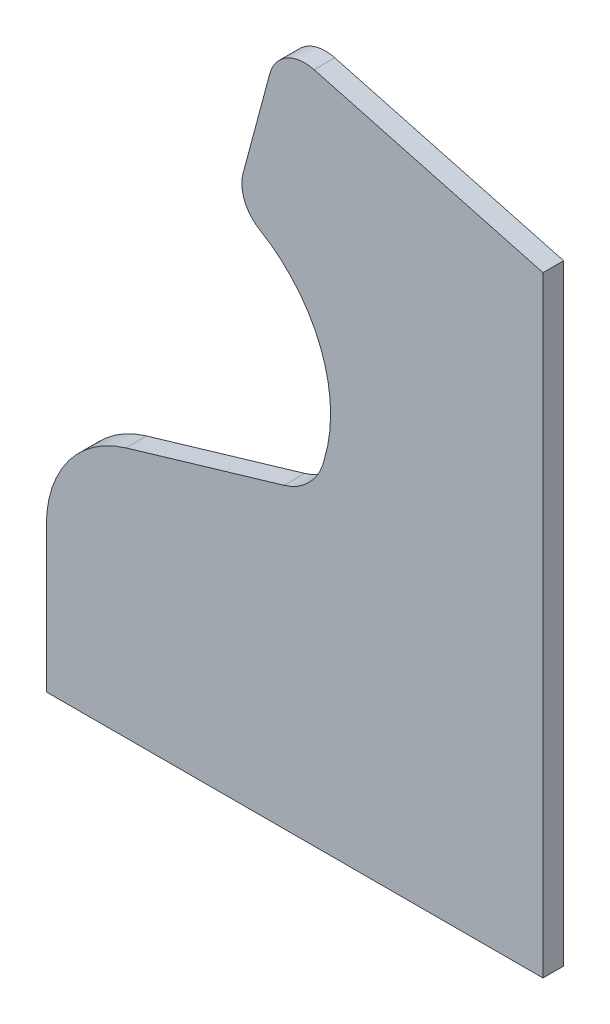
ISO-10303-21;
HEADER;
FILE_DESCRIPTION(('STEP AP214'),'2;1');
FILE_NAME('part.step','',(''),(''),'','','');
FILE_SCHEMA(('AUTOMOTIVE_DESIGN { 1 0 10303 214 1 1 1 1 }'));
ENDSEC;
DATA;
#1=APPLICATION_CONTEXT('core data for automotive mechanical design processes');
#2=APPLICATION_PROTOCOL_DEFINITION('international standard','automotive_design',2000,#1);
#3=PRODUCT_CONTEXT('',#1,'mechanical');
#4=PRODUCT('Part','Part','',(#3));
#5=PRODUCT_RELATED_PRODUCT_CATEGORY('part','',(#4));
#6=PRODUCT_DEFINITION_FORMATION('','',#4);
#7=PRODUCT_DEFINITION_CONTEXT('part definition',#1,'design');
#8=PRODUCT_DEFINITION('design','',#6,#7);
#9=PRODUCT_DEFINITION_SHAPE('','',#8);
#10=(LENGTH_UNIT() NAMED_UNIT(*) SI_UNIT(.MILLI.,.METRE.));
#11=(NAMED_UNIT(*) PLANE_ANGLE_UNIT() SI_UNIT($,.RADIAN.));
#12=(NAMED_UNIT(*) SI_UNIT($,.STERADIAN.) SOLID_ANGLE_UNIT());
#13=UNCERTAINTY_MEASURE_WITH_UNIT(LENGTH_MEASURE(1.E-05),#10,'distance_accuracy_value','');
#14=(GEOMETRIC_REPRESENTATION_CONTEXT(3) GLOBAL_UNCERTAINTY_ASSIGNED_CONTEXT((#13)) GLOBAL_UNIT_ASSIGNED_CONTEXT((#10,
#11,#12)) REPRESENTATION_CONTEXT('',''));
#15=CARTESIAN_POINT('',(0.,0.,0.));
#16=DIRECTION('',(0.,0.,1.));
#17=DIRECTION('',(1.,0.,0.));
#18=AXIS2_PLACEMENT_3D('',#15,#16,#17);
#19=CARTESIAN_POINT('',(90.0769515458648,336.171759760097,10.));
#20=DIRECTION('',(0.258819045102514,0.96592582628907,0.));
#21=DIRECTION('',(-0.96592582628907,0.258819045102514,0.));
#22=AXIS2_PLACEMENT_3D('',#19,#20,#21);
#23=PLANE('',#22);
#24=DIRECTION('',(0.96592582628907,-0.258819045102514,0.));
#25=VECTOR('',#24,1.);
#26=CARTESIAN_POINT('',(90.0769515458648,336.171759760097,0.));
#27=LINE('',#26,#25);
#28=CARTESIAN_POINT('',(129.081215867117,325.720598633847,0.));
#29=VERTEX_POINT('',#28);
#30=CARTESIAN_POINT('',(240.,296.,0.));
#31=VERTEX_POINT('',#30);
#32=EDGE_CURVE('E169',#29,#31,#27,.T.);
#33=ORIENTED_EDGE('',*,*,#32,.F.);
#34=DIRECTION('',(0.,0.,-1.));
#35=VECTOR('',#34,1.);
#36=CARTESIAN_POINT('',(129.081215867117,325.720598633847,10.));
#37=LINE('',#36,#35);
#38=CARTESIAN_POINT('',(129.081215867117,325.720598633847,10.));
#39=VERTEX_POINT('',#38);
#40=EDGE_CURVE('E11',#39,#29,#37,.T.);
#41=ORIENTED_EDGE('',*,*,#40,.F.);
#42=DIRECTION('',(0.96592582628907,-0.258819045102514,0.));
#43=VECTOR('',#42,1.);
#44=CARTESIAN_POINT('',(90.0769515458648,336.171759760097,10.));
#45=LINE('',#44,#43);
#46=CARTESIAN_POINT('',(240.,296.,10.));
#47=VERTEX_POINT('',#46);
#48=EDGE_CURVE('E208',#39,#47,#45,.T.);
#49=ORIENTED_EDGE('',*,*,#48,.T.);
#50=DIRECTION('',(0.,0.,-1.));
#51=VECTOR('',#50,1.);
#52=CARTESIAN_POINT('',(240.,296.,10.));
#53=LINE('',#52,#51);
#54=EDGE_CURVE('E109',#47,#31,#53,.T.);
#55=ORIENTED_EDGE('',*,*,#54,.T.);
#56=EDGE_LOOP('',(#33,#41,#49,#55));
#57=FACE_BOUND('',#56,.T.);
#58=ADVANCED_FACE('F49',(#57),#23,.T.);
#59=CARTESIAN_POINT('',(124.543141157005,308.784273247164,10.));
#60=DIRECTION('',(0.,0.,-1.));
#61=DIRECTION('',(-1.,0.,0.));
#62=AXIS2_PLACEMENT_3D('',#59,#60,#61);
#63=CYLINDRICAL_SURFACE('',#62,17.5337742565075);
#64=CARTESIAN_POINT('',(124.543141157005,308.784273247164,0.));
#65=DIRECTION('',(0.,0.,1.));
#66=DIRECTION('',(1.,0.,0.));
#67=AXIS2_PLACEMENT_3D('',#64,#65,#66);
#68=CIRCLE('',#67,17.5337742565075);
#69=CARTESIAN_POINT('',(107.606815770322,313.322347957276,0.));
#70=VERTEX_POINT('',#69);
#71=EDGE_CURVE('E173',#29,#70,#68,.T.);
#72=ORIENTED_EDGE('',*,*,#71,.T.);
#73=DIRECTION('',(0.,0.,-1.));
#74=VECTOR('',#73,1.);
#75=CARTESIAN_POINT('',(107.606815770322,313.322347957276,10.));
#76=LINE('',#75,#74);
#77=CARTESIAN_POINT('',(107.606815770322,313.322347957276,10.));
#78=VERTEX_POINT('',#77);
#79=EDGE_CURVE('E58',#78,#70,#76,.T.);
#80=ORIENTED_EDGE('',*,*,#79,.F.);
#81=CARTESIAN_POINT('',(124.543141157005,308.784273247164,10.));
#82=DIRECTION('',(0.,0.,1.));
#83=DIRECTION('',(1.,0.,0.));
#84=AXIS2_PLACEMENT_3D('',#81,#82,#83);
#85=CIRCLE('',#84,17.5337742565075);
#86=EDGE_CURVE('E256',#39,#78,#85,.T.);
#87=ORIENTED_EDGE('',*,*,#86,.F.);
#88=ORIENTED_EDGE('',*,*,#40,.T.);
#89=EDGE_LOOP('',(#72,#80,#87,#88));
#90=FACE_BOUND('',#89,.T.);
#91=ADVANCED_FACE('F241',(#90),#63,.T.);
#92=CARTESIAN_POINT('',(22.0679389345696,-5.91308641613707,10.));
#93=DIRECTION('',(-0.96592582628907,0.258819045102514,0.));
#94=DIRECTION('',(-0.258819045102514,-0.96592582628907,0.));
#95=AXIS2_PLACEMENT_3D('',#92,#93,#94);
#96=PLANE('',#95);
#97=DIRECTION('',(0.258819045102514,0.96592582628907,0.));
#98=VECTOR('',#97,1.);
#99=CARTESIAN_POINT('',(22.0679389345696,-5.91308641613707,0.));
#100=LINE('',#99,#98);
#101=CARTESIAN_POINT('',(94.6658635151962,265.026056642823,0.));
#102=VERTEX_POINT('',#101);
#103=EDGE_CURVE('E177',#102,#70,#100,.T.);
#104=ORIENTED_EDGE('',*,*,#103,.F.);
#105=DIRECTION('',(0.,0.,-1.));
#106=VECTOR('',#105,1.);
#107=CARTESIAN_POINT('',(94.6658635151962,265.026056642823,10.));
#108=LINE('',#107,#106);
#109=CARTESIAN_POINT('',(94.6658635151962,265.026056642823,10.));
#110=VERTEX_POINT('',#109);
#111=EDGE_CURVE('E227',#110,#102,#108,.T.);
#112=ORIENTED_EDGE('',*,*,#111,.F.);
#113=DIRECTION('',(0.258819045102514,0.96592582628907,0.));
#114=VECTOR('',#113,1.);
#115=CARTESIAN_POINT('',(22.0679389345696,-5.91308641613707,10.));
#116=LINE('',#115,#114);
#117=EDGE_CURVE('E238',#110,#78,#116,.T.);
#118=ORIENTED_EDGE('',*,*,#117,.T.);
#119=ORIENTED_EDGE('',*,*,#79,.T.);
#120=EDGE_LOOP('',(#104,#112,#118,#119));
#121=FACE_BOUND('',#120,.T.);
#122=ADVANCED_FACE('F236',(#121),#96,.T.);
#123=CARTESIAN_POINT('',(111.602188901879,260.487981932711,10.));
#124=DIRECTION('',(0.,0.,-1.));
#125=DIRECTION('',(-1.,0.,0.));
#126=AXIS2_PLACEMENT_3D('',#123,#124,#125);
#127=CYLINDRICAL_SURFACE('',#126,17.5337742565074);
#128=CARTESIAN_POINT('',(111.602188901879,260.487981932711,0.));
#129=DIRECTION('',(0.,0.,1.));
#130=DIRECTION('',(1.,0.,0.));
#131=AXIS2_PLACEMENT_3D('',#128,#129,#130);
#132=CIRCLE('',#131,17.5337742565074);
#133=CARTESIAN_POINT('',(102.682371844657,245.392614983085,0.));
#134=VERTEX_POINT('',#133);
#135=EDGE_CURVE('E181',#102,#134,#132,.T.);
#136=ORIENTED_EDGE('',*,*,#135,.T.);
#137=DIRECTION('',(0.,0.,-1.));
#138=VECTOR('',#137,1.);
#139=CARTESIAN_POINT('',(102.682371844657,245.392614983085,10.));
#140=LINE('',#139,#138);
#141=CARTESIAN_POINT('',(102.682371844657,245.392614983085,10.));
#142=VERTEX_POINT('',#141);
#143=EDGE_CURVE('E224',#142,#134,#140,.T.);
#144=ORIENTED_EDGE('',*,*,#143,.F.);
#145=CARTESIAN_POINT('',(111.602188901879,260.487981932711,10.));
#146=DIRECTION('',(0.,0.,1.));
#147=DIRECTION('',(1.,0.,0.));
#148=AXIS2_PLACEMENT_3D('',#145,#146,#147);
#149=CIRCLE('',#148,17.5337742565074);
#150=EDGE_CURVE('E251',#110,#142,#149,.T.);
#151=ORIENTED_EDGE('',*,*,#150,.F.);
#152=ORIENTED_EDGE('',*,*,#111,.T.);
#153=EDGE_LOOP('',(#136,#144,#151,#152));
#154=FACE_BOUND('',#153,.T.);
#155=ADVANCED_FACE('F248',(#154),#127,.T.);
#156=CARTESIAN_POINT('',(67.069557117966,185.123609132436,10.));
#157=DIRECTION('',(0.,0.,-1.));
#158=DIRECTION('',(-1.,0.,0.));
#159=AXIS2_PLACEMENT_3D('',#156,#157,#158);
#160=CYLINDRICAL_SURFACE('',#159,70.0044687072414);
#161=CARTESIAN_POINT('',(67.069557117966,185.123609132436,0.));
#162=DIRECTION('',(0.,0.,1.));
#163=DIRECTION('',(1.,0.,0.));
#164=AXIS2_PLACEMENT_3D('',#161,#162,#163);
#165=CIRCLE('',#164,70.0044687072414);
#166=CARTESIAN_POINT('',(134.121677328703,165.007973069215,0.));
#167=VERTEX_POINT('',#166);
#168=EDGE_CURVE('E185',#167,#134,#165,.T.);
#169=ORIENTED_EDGE('',*,*,#168,.F.);
#170=DIRECTION('',(0.,0.,-1.));
#171=VECTOR('',#170,1.);
#172=CARTESIAN_POINT('',(134.121677328703,165.007973069215,10.));
#173=LINE('',#172,#171);
#174=CARTESIAN_POINT('',(134.121677328703,165.007973069215,10.));
#175=VERTEX_POINT('',#174);
#176=EDGE_CURVE('E221',#175,#167,#173,.T.);
#177=ORIENTED_EDGE('',*,*,#176,.F.);
#178=CARTESIAN_POINT('',(67.069557117966,185.123609132436,10.));
#179=DIRECTION('',(0.,0.,1.));
#180=DIRECTION('',(1.,0.,0.));
#181=AXIS2_PLACEMENT_3D('',#178,#179,#180);
#182=CIRCLE('',#181,70.0044687072414);
#183=EDGE_CURVE('E254',#175,#142,#182,.T.);
#184=ORIENTED_EDGE('',*,*,#183,.T.);
#185=ORIENTED_EDGE('',*,*,#143,.T.);
#186=EDGE_LOOP('',(#169,#177,#184,#185));
#187=FACE_BOUND('',#186,.T.);
#188=ADVANCED_FACE('F325',(#187),#160,.F.);
#189=CARTESIAN_POINT('',(106.546455915018,171.114356662886,10.));
#190=DIRECTION('',(0.,0.,-1.));
#191=DIRECTION('',(-1.,0.,0.));
#192=AXIS2_PLACEMENT_3D('',#189,#190,#191);
#193=CYLINDRICAL_SURFACE('',#192,28.2432426715991);
#194=CARTESIAN_POINT('',(106.546455915018,171.114356662886,0.));
#195=DIRECTION('',(0.,0.,1.));
#196=DIRECTION('',(1.,0.,0.));
#197=AXIS2_PLACEMENT_3D('',#194,#195,#196);
#198=CIRCLE('',#197,28.2432426715991);
#199=CARTESIAN_POINT('',(114.537816123471,144.025264418487,0.));
#200=VERTEX_POINT('',#199);
#201=EDGE_CURVE('E189',#200,#167,#198,.T.);
#202=ORIENTED_EDGE('',*,*,#201,.F.);
#203=DIRECTION('',(0.,0.,-1.));
#204=VECTOR('',#203,1.);
#205=CARTESIAN_POINT('',(114.537816123471,144.025264418487,10.));
#206=LINE('',#205,#204);
#207=CARTESIAN_POINT('',(114.537816123471,144.025264418487,10.));
#208=VERTEX_POINT('',#207);
#209=EDGE_CURVE('E218',#208,#200,#206,.T.);
#210=ORIENTED_EDGE('',*,*,#209,.F.);
#211=CARTESIAN_POINT('',(106.546455915018,171.114356662886,10.));
#212=DIRECTION('',(0.,0.,1.));
#213=DIRECTION('',(1.,0.,0.));
#214=AXIS2_PLACEMENT_3D('',#211,#212,#213);
#215=CIRCLE('',#214,28.2432426715991);
#216=EDGE_CURVE('E267',#208,#175,#215,.T.);
#217=ORIENTED_EDGE('',*,*,#216,.T.);
#218=ORIENTED_EDGE('',*,*,#176,.T.);
#219=EDGE_LOOP('',(#202,#210,#217,#218));
#220=FACE_BOUND('',#219,.T.);
#221=ADVANCED_FACE('F328',(#220),#193,.F.);
#222=CARTESIAN_POINT('',(-29.9164865998592,101.41082919459,10.));
#223=DIRECTION('',(-0.282947687748671,0.959135342898843,0.));
#224=DIRECTION('',(-0.959135342898843,-0.282947687748671,0.));
#225=AXIS2_PLACEMENT_3D('',#222,#223,#224);
#226=PLANE('',#225);
#227=DIRECTION('',(0.959135342898843,0.282947687748671,0.));
#228=VECTOR('',#227,1.);
#229=CARTESIAN_POINT('',(-29.9164865998592,101.41082919459,0.));
#230=LINE('',#229,#228);
#231=CARTESIAN_POINT('',(37.9160170195723,121.421613069276,0.));
#232=VERTEX_POINT('',#231);
#233=EDGE_CURVE('E193',#232,#200,#230,.T.);
#234=ORIENTED_EDGE('',*,*,#233,.F.);
#235=DIRECTION('',(0.,0.,-1.));
#236=VECTOR('',#235,1.);
#237=CARTESIAN_POINT('',(37.9160170195723,121.421613069276,10.));
#238=LINE('',#237,#236);
#239=CARTESIAN_POINT('',(37.9160170195723,121.421613069276,10.));
#240=VERTEX_POINT('',#239);
#241=EDGE_CURVE('E215',#240,#232,#238,.T.);
#242=ORIENTED_EDGE('',*,*,#241,.F.);
#243=DIRECTION('',(0.959135342898843,0.282947687748671,0.));
#244=VECTOR('',#243,1.);
#245=CARTESIAN_POINT('',(-29.9164865998592,101.41082919459,10.));
#246=LINE('',#245,#244);
#247=EDGE_CURVE('E271',#240,#208,#246,.T.);
#248=ORIENTED_EDGE('',*,*,#247,.T.);
#249=ORIENTED_EDGE('',*,*,#209,.T.);
#250=EDGE_LOOP('',(#234,#242,#248,#249));
#251=FACE_BOUND('',#250,.T.);
#252=ADVANCED_FACE('F332',(#251),#226,.T.);
#253=CARTESIAN_POINT('',(53.140198272095,69.8147226854853,10.));
#254=DIRECTION('',(0.,0.,-1.));
#255=DIRECTION('',(-1.,0.,0.));
#256=AXIS2_PLACEMENT_3D('',#253,#254,#255);
#257=CYLINDRICAL_SURFACE('',#256,53.8056393874676);
#258=CARTESIAN_POINT('',(53.140198272095,69.8147226854853,0.));
#259=DIRECTION('',(0.,0.,1.));
#260=DIRECTION('',(1.,0.,0.));
#261=AXIS2_PLACEMENT_3D('',#258,#259,#260);
#262=CIRCLE('',#261,53.8056393874676);
#263=CARTESIAN_POINT('',(-0.66544111537261,69.8147226854853,0.));
#264=VERTEX_POINT('',#263);
#265=EDGE_CURVE('E197',#232,#264,#262,.T.);
#266=ORIENTED_EDGE('',*,*,#265,.T.);
#267=DIRECTION('',(0.,0.,-1.));
#268=VECTOR('',#267,1.);
#269=CARTESIAN_POINT('',(-0.66544111537261,69.8147226854853,10.));
#270=LINE('',#269,#268);
#271=CARTESIAN_POINT('',(-0.66544111537261,69.8147226854853,10.));
#272=VERTEX_POINT('',#271);
#273=EDGE_CURVE('E158',#272,#264,#270,.T.);
#274=ORIENTED_EDGE('',*,*,#273,.F.);
#275=CARTESIAN_POINT('',(53.140198272095,69.8147226854853,10.));
#276=DIRECTION('',(0.,0.,1.));
#277=DIRECTION('',(1.,0.,0.));
#278=AXIS2_PLACEMENT_3D('',#275,#276,#277);
#279=CIRCLE('',#278,53.8056393874676);
#280=EDGE_CURVE('E143',#240,#272,#279,.T.);
#281=ORIENTED_EDGE('',*,*,#280,.F.);
#282=ORIENTED_EDGE('',*,*,#241,.T.);
#283=EDGE_LOOP('',(#266,#274,#281,#282));
#284=FACE_BOUND('',#283,.T.);
#285=ADVANCED_FACE('F336',(#284),#257,.T.);
#286=CARTESIAN_POINT('',(-0.665441115372601,0.,10.));
#287=DIRECTION('',(1.,0.,0.));
#288=DIRECTION('',(0.,1.,0.));
#289=AXIS2_PLACEMENT_3D('',#286,#287,#288);
#290=PLANE('',#289);
#291=DIRECTION('',(0.,-1.,0.));
#292=VECTOR('',#291,1.);
#293=CARTESIAN_POINT('',(-0.665441115372601,0.,0.));
#294=LINE('',#293,#292);
#295=CARTESIAN_POINT('',(-0.665441115372601,-0.303814753215342,0.));
#296=VERTEX_POINT('',#295);
#297=EDGE_CURVE('E153',#264,#296,#294,.T.);
#298=ORIENTED_EDGE('',*,*,#297,.T.);
#299=DIRECTION('',(0.,0.,-1.));
#300=VECTOR('',#299,1.);
#301=CARTESIAN_POINT('',(-0.665441115372601,-0.303814753215342,10.));
#302=LINE('',#301,#300);
#303=CARTESIAN_POINT('',(-0.665441115372601,-0.303814753215342,10.));
#304=VERTEX_POINT('',#303);
#305=EDGE_CURVE('E150',#304,#296,#302,.T.);
#306=ORIENTED_EDGE('',*,*,#305,.F.);
#307=DIRECTION('',(0.,-1.,0.));
#308=VECTOR('',#307,1.);
#309=CARTESIAN_POINT('',(-0.665441115372601,0.,10.));
#310=LINE('',#309,#308);
#311=EDGE_CURVE('E136',#272,#304,#310,.T.);
#312=ORIENTED_EDGE('',*,*,#311,.F.);
#313=ORIENTED_EDGE('',*,*,#273,.T.);
#314=EDGE_LOOP('',(#298,#306,#312,#313));
#315=FACE_BOUND('',#314,.T.);
#316=ADVANCED_FACE('F151',(#315),#290,.F.);
#317=CARTESIAN_POINT('',(0.000382473020602556,-0.302974221112955,10.));
#318=DIRECTION('',(0.00126239359386999,-0.99999920318089,0.));
#319=DIRECTION('',(0.99999920318089,0.00126239359386999,0.));
#320=AXIS2_PLACEMENT_3D('',#317,#318,#319);
#321=PLANE('',#320);
#322=DIRECTION('',(-0.99999920318089,-0.00126239359386999,0.));
#323=VECTOR('',#322,1.);
#324=CARTESIAN_POINT('',(0.000382473020602556,-0.302974221112955,0.));
#325=LINE('',#324,#323);
#326=CARTESIAN_POINT('',(240.,0.,0.));
#327=VERTEX_POINT('',#326);
#328=EDGE_CURVE('E202',#327,#296,#325,.T.);
#329=ORIENTED_EDGE('',*,*,#328,.F.);
#330=DIRECTION('',(0.,0.,-1.));
#331=VECTOR('',#330,1.);
#332=CARTESIAN_POINT('',(240.,0.,10.));
#333=LINE('',#332,#331);
#334=CARTESIAN_POINT('',(240.,0.,10.));
#335=VERTEX_POINT('',#334);
#336=EDGE_CURVE('E102',#335,#327,#333,.T.);
#337=ORIENTED_EDGE('',*,*,#336,.F.);
#338=DIRECTION('',(-0.99999920318089,-0.00126239359386999,0.));
#339=VECTOR('',#338,1.);
#340=CARTESIAN_POINT('',(0.000382473020602556,-0.302974221112955,10.));
#341=LINE('',#340,#339);
#342=EDGE_CURVE('E140',#335,#304,#341,.T.);
#343=ORIENTED_EDGE('',*,*,#342,.T.);
#344=ORIENTED_EDGE('',*,*,#305,.T.);
#345=EDGE_LOOP('',(#329,#337,#343,#344));
#346=FACE_BOUND('',#345,.T.);
#347=ADVANCED_FACE('F160',(#346),#321,.T.);
#348=CARTESIAN_POINT('',(240.,0.,10.));
#349=DIRECTION('',(-1.,0.,0.));
#350=DIRECTION('',(0.,-1.,0.));
#351=AXIS2_PLACEMENT_3D('',#348,#349,#350);
#352=PLANE('',#351);
#353=DIRECTION('',(0.,1.,0.));
#354=VECTOR('',#353,1.);
#355=CARTESIAN_POINT('',(240.,0.,0.));
#356=LINE('',#355,#354);
#357=EDGE_CURVE('E205',#327,#31,#356,.T.);
#358=ORIENTED_EDGE('',*,*,#357,.T.);
#359=ORIENTED_EDGE('',*,*,#54,.F.);
#360=DIRECTION('',(0.,1.,0.));
#361=VECTOR('',#360,1.);
#362=CARTESIAN_POINT('',(240.,0.,10.));
#363=LINE('',#362,#361);
#364=EDGE_CURVE('E66',#335,#47,#363,.T.);
#365=ORIENTED_EDGE('',*,*,#364,.F.);
#366=ORIENTED_EDGE('',*,*,#336,.T.);
#367=EDGE_LOOP('',(#358,#359,#365,#366));
#368=FACE_BOUND('',#367,.T.);
#369=ADVANCED_FACE('F345',(#368),#352,.F.);
#370=CARTESIAN_POINT('',(0.,0.,10.));
#371=DIRECTION('',(0.,0.,1.));
#372=DIRECTION('',(1.,0.,0.));
#373=AXIS2_PLACEMENT_3D('',#370,#371,#372);
#374=PLANE('',#373);
#375=ORIENTED_EDGE('',*,*,#48,.F.);
#376=ORIENTED_EDGE('',*,*,#86,.T.);
#377=ORIENTED_EDGE('',*,*,#117,.F.);
#378=ORIENTED_EDGE('',*,*,#150,.T.);
#379=ORIENTED_EDGE('',*,*,#183,.F.);
#380=ORIENTED_EDGE('',*,*,#216,.F.);
#381=ORIENTED_EDGE('',*,*,#247,.F.);
#382=ORIENTED_EDGE('',*,*,#280,.T.);
#383=ORIENTED_EDGE('',*,*,#311,.T.);
#384=ORIENTED_EDGE('',*,*,#342,.F.);
#385=ORIENTED_EDGE('',*,*,#364,.T.);
#386=EDGE_LOOP('',(#375,#376,#377,#378,#379,#380,#381,#382,#383,#384,#385));
#387=FACE_BOUND('',#386,.T.);
#388=ADVANCED_FACE('F138',(#387),#374,.T.);
#389=CARTESIAN_POINT('',(0.,0.,0.));
#390=DIRECTION('',(0.,0.,1.));
#391=DIRECTION('',(1.,0.,0.));
#392=AXIS2_PLACEMENT_3D('',#389,#390,#391);
#393=PLANE('',#392);
#394=ORIENTED_EDGE('',*,*,#32,.T.);
#395=ORIENTED_EDGE('',*,*,#357,.F.);
#396=ORIENTED_EDGE('',*,*,#328,.T.);
#397=ORIENTED_EDGE('',*,*,#297,.F.);
#398=ORIENTED_EDGE('',*,*,#265,.F.);
#399=ORIENTED_EDGE('',*,*,#233,.T.);
#400=ORIENTED_EDGE('',*,*,#201,.T.);
#401=ORIENTED_EDGE('',*,*,#168,.T.);
#402=ORIENTED_EDGE('',*,*,#135,.F.);
#403=ORIENTED_EDGE('',*,*,#103,.T.);
#404=ORIENTED_EDGE('',*,*,#71,.F.);
#405=EDGE_LOOP('',(#394,#395,#396,#397,#398,#399,#400,#401,#402,#403,#404));
#406=FACE_BOUND('',#405,.T.);
#407=ADVANCED_FACE('F244',(#406),#393,.F.);
#408=CLOSED_SHELL('',(#58,#91,#122,#155,#188,#221,#252,#285,#316,#347,#369,#388,#407));
#409=MANIFOLD_SOLID_BREP('B2',#408);
#410=ADVANCED_BREP_SHAPE_REPRESENTATION('',(#18,#409),#14);
#411=SHAPE_DEFINITION_REPRESENTATION(#9,#410);
ENDSEC;
END-ISO-10303-21;
